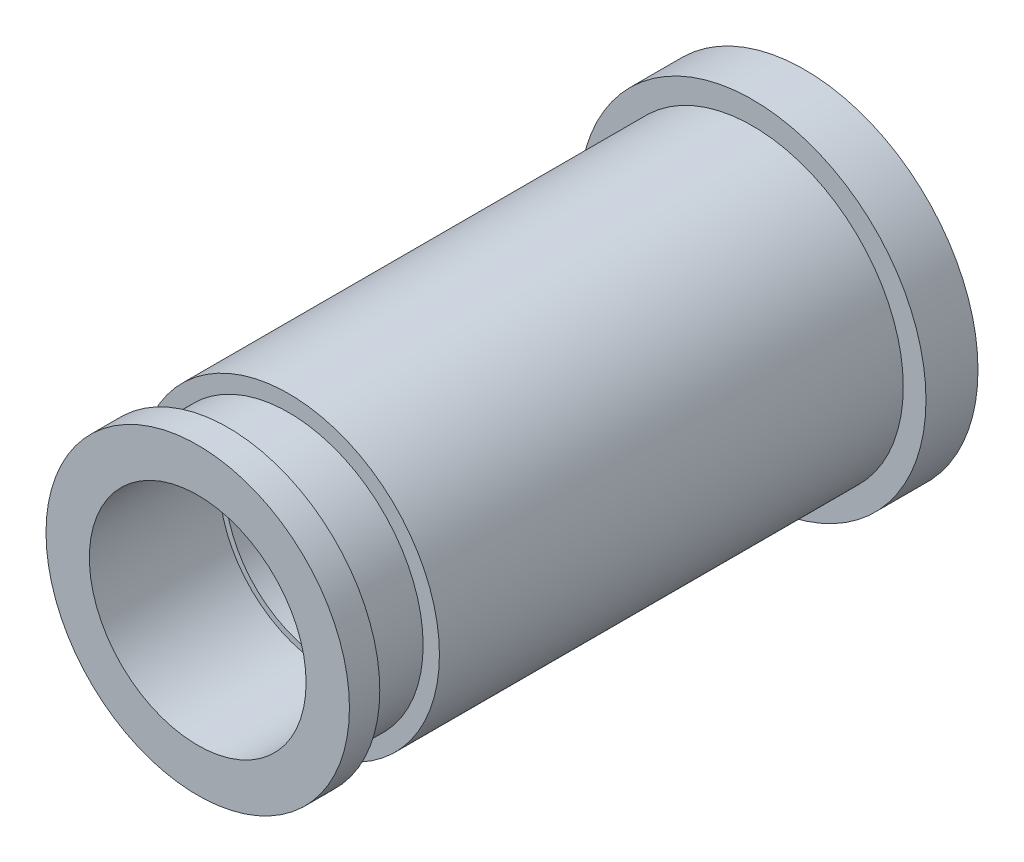
ISO-10303-21;
HEADER;
FILE_DESCRIPTION(('STEP AP214'),'2;1');
FILE_NAME('part.step','',(''),(''),'','','');
FILE_SCHEMA(('AUTOMOTIVE_DESIGN { 1 0 10303 214 1 1 1 1 }'));
ENDSEC;
DATA;
#1=APPLICATION_CONTEXT('core data for automotive mechanical design processes');
#2=APPLICATION_PROTOCOL_DEFINITION('international standard','automotive_design',2000,#1);
#3=PRODUCT_CONTEXT('',#1,'mechanical');
#4=PRODUCT('Part','Part','',(#3));
#5=PRODUCT_RELATED_PRODUCT_CATEGORY('part','',(#4));
#6=PRODUCT_DEFINITION_FORMATION('','',#4);
#7=PRODUCT_DEFINITION_CONTEXT('part definition',#1,'design');
#8=PRODUCT_DEFINITION('design','',#6,#7);
#9=PRODUCT_DEFINITION_SHAPE('','',#8);
#10=(LENGTH_UNIT() NAMED_UNIT(*) SI_UNIT(.MILLI.,.METRE.));
#11=(NAMED_UNIT(*) PLANE_ANGLE_UNIT() SI_UNIT($,.RADIAN.));
#12=(NAMED_UNIT(*) SI_UNIT($,.STERADIAN.) SOLID_ANGLE_UNIT());
#13=UNCERTAINTY_MEASURE_WITH_UNIT(LENGTH_MEASURE(1.E-05),#10,'distance_accuracy_value','');
#14=(GEOMETRIC_REPRESENTATION_CONTEXT(3) GLOBAL_UNCERTAINTY_ASSIGNED_CONTEXT((#13)) GLOBAL_UNIT_ASSIGNED_CONTEXT((#10,
#11,#12)) REPRESENTATION_CONTEXT('',''));
#15=CARTESIAN_POINT('',(0.,0.,0.));
#16=DIRECTION('',(0.,0.,1.));
#17=DIRECTION('',(1.,0.,0.));
#18=AXIS2_PLACEMENT_3D('',#15,#16,#17);
#19=CARTESIAN_POINT('',(0.,19.84375,61.2065264612954));
#20=DIRECTION('',(0.,0.,-1.));
#21=DIRECTION('',(-1.,0.,0.));
#22=AXIS2_PLACEMENT_3D('',#19,#20,#21);
#23=PLANE('',#22);
#24=CARTESIAN_POINT('',(0.,0.,61.2065264612954));
#25=DIRECTION('',(0.,0.,1.));
#26=DIRECTION('',(1.,0.,0.));
#27=AXIS2_PLACEMENT_3D('',#24,#25,#26);
#28=CIRCLE('',#27,19.84375);
#29=CARTESIAN_POINT('',(19.84375,0.,61.2065264612954));
#30=VERTEX_POINT('',#29);
#31=EDGE_CURVE('E90',#30,#30,#28,.T.);
#32=ORIENTED_EDGE('',*,*,#31,.F.);
#33=EDGE_LOOP('',(#32));
#34=FACE_BOUND('',#33,.T.);
#35=CARTESIAN_POINT('',(0.,0.,61.2065264612954));
#36=DIRECTION('',(0.,0.,1.));
#37=DIRECTION('',(1.,0.,0.));
#38=AXIS2_PLACEMENT_3D('',#35,#36,#37);
#39=CIRCLE('',#38,27.78125);
#40=CARTESIAN_POINT('',(27.78125,0.,61.2065264612954));
#41=VERTEX_POINT('',#40);
#42=EDGE_CURVE('E57',#41,#41,#39,.T.);
#43=ORIENTED_EDGE('',*,*,#42,.T.);
#44=EDGE_LOOP('',(#43));
#45=FACE_BOUND('',#44,.T.);
#46=ADVANCED_FACE('F46',(#34,#45),#23,.F.);
#47=CARTESIAN_POINT('',(0.,0.,20.5396919431279));
#48=DIRECTION('',(0.,0.,1.));
#49=DIRECTION('',(1.,0.,0.));
#50=AXIS2_PLACEMENT_3D('',#47,#48,#49);
#51=CYLINDRICAL_SURFACE('',#50,27.78125);
#52=ORIENTED_EDGE('',*,*,#42,.F.);
#53=EDGE_LOOP('',(#52));
#54=FACE_BOUND('',#53,.T.);
#55=CARTESIAN_POINT('',(0.,0.,55.6502764612954));
#56=DIRECTION('',(0.,0.,1.));
#57=DIRECTION('',(1.,0.,0.));
#58=AXIS2_PLACEMENT_3D('',#55,#56,#57);
#59=CIRCLE('',#58,27.78125);
#60=CARTESIAN_POINT('',(27.78125,0.,55.6502764612954));
#61=VERTEX_POINT('',#60);
#62=EDGE_CURVE('E61',#61,#61,#59,.T.);
#63=ORIENTED_EDGE('',*,*,#62,.T.);
#64=EDGE_LOOP('',(#63));
#65=FACE_BOUND('',#64,.T.);
#66=ADVANCED_FACE('F98',(#54,#65),#51,.T.);
#67=CARTESIAN_POINT('',(0.,27.78125,55.6502764612954));
#68=DIRECTION('',(0.,0.,1.));
#69=DIRECTION('',(1.,0.,0.));
#70=AXIS2_PLACEMENT_3D('',#67,#68,#69);
#71=PLANE('',#70);
#72=ORIENTED_EDGE('',*,*,#62,.F.);
#73=EDGE_LOOP('',(#72));
#74=FACE_BOUND('',#73,.T.);
#75=CARTESIAN_POINT('',(0.,0.,55.6502764612954));
#76=DIRECTION('',(0.,0.,1.));
#77=DIRECTION('',(1.,0.,0.));
#78=AXIS2_PLACEMENT_3D('',#75,#76,#77);
#79=CIRCLE('',#78,24.60625);
#80=CARTESIAN_POINT('',(24.60625,0.,55.6502764612954));
#81=VERTEX_POINT('',#80);
#82=EDGE_CURVE('E66',#81,#81,#79,.T.);
#83=ORIENTED_EDGE('',*,*,#82,.T.);
#84=EDGE_LOOP('',(#83));
#85=FACE_BOUND('',#84,.T.);
#86=ADVANCED_FACE('F103',(#74,#85),#71,.F.);
#87=CARTESIAN_POINT('',(0.,0.,20.5396919431279));
#88=DIRECTION('',(0.,0.,1.));
#89=DIRECTION('',(1.,0.,0.));
#90=AXIS2_PLACEMENT_3D('',#87,#88,#89);
#91=CYLINDRICAL_SURFACE('',#90,24.60625);
#92=ORIENTED_EDGE('',*,*,#82,.F.);
#93=EDGE_LOOP('',(#92));
#94=FACE_BOUND('',#93,.T.);
#95=CARTESIAN_POINT('',(0.,0.,44.5377764612954));
#96=DIRECTION('',(0.,0.,1.));
#97=DIRECTION('',(1.,0.,0.));
#98=AXIS2_PLACEMENT_3D('',#95,#96,#97);
#99=CIRCLE('',#98,24.60625);
#100=CARTESIAN_POINT('',(24.60625,0.,44.5377764612954));
#101=VERTEX_POINT('',#100);
#102=EDGE_CURVE('E69',#101,#101,#99,.T.);
#103=ORIENTED_EDGE('',*,*,#102,.T.);
#104=EDGE_LOOP('',(#103));
#105=FACE_BOUND('',#104,.T.);
#106=ADVANCED_FACE('F109',(#94,#105),#91,.T.);
#107=CARTESIAN_POINT('',(0.,24.60625,44.5377764612954));
#108=DIRECTION('',(0.,0.,-1.));
#109=DIRECTION('',(-1.,0.,0.));
#110=AXIS2_PLACEMENT_3D('',#107,#108,#109);
#111=PLANE('',#110);
#112=ORIENTED_EDGE('',*,*,#102,.F.);
#113=EDGE_LOOP('',(#112));
#114=FACE_BOUND('',#113,.T.);
#115=CARTESIAN_POINT('',(0.,0.,44.5377764612954));
#116=DIRECTION('',(0.,0.,1.));
#117=DIRECTION('',(1.,0.,0.));
#118=AXIS2_PLACEMENT_3D('',#115,#116,#117);
#119=CIRCLE('',#118,27.5906496840442);
#120=CARTESIAN_POINT('',(27.5906496840442,0.,44.5377764612954));
#121=VERTEX_POINT('',#120);
#122=EDGE_CURVE('E72',#121,#121,#119,.T.);
#123=ORIENTED_EDGE('',*,*,#122,.T.);
#124=EDGE_LOOP('',(#123));
#125=FACE_BOUND('',#124,.T.);
#126=ADVANCED_FACE('F115',(#114,#125),#111,.F.);
#127=CARTESIAN_POINT('',(0.,0.,20.5396919431279));
#128=DIRECTION('',(0.,0.,1.));
#129=DIRECTION('',(1.,0.,0.));
#130=AXIS2_PLACEMENT_3D('',#127,#128,#129);
#131=CYLINDRICAL_SURFACE('',#130,27.5906496840442);
#132=ORIENTED_EDGE('',*,*,#122,.F.);
#133=EDGE_LOOP('',(#132));
#134=FACE_BOUND('',#133,.T.);
#135=CARTESIAN_POINT('',(0.,0.,-40.3934735387046));
#136=DIRECTION('',(0.,0.,1.));
#137=DIRECTION('',(1.,0.,0.));
#138=AXIS2_PLACEMENT_3D('',#135,#136,#137);
#139=CIRCLE('',#138,27.5906496840442);
#140=CARTESIAN_POINT('',(27.5906496840442,0.,-40.3934735387046));
#141=VERTEX_POINT('',#140);
#142=EDGE_CURVE('E75',#141,#141,#139,.T.);
#143=ORIENTED_EDGE('',*,*,#142,.T.);
#144=EDGE_LOOP('',(#143));
#145=FACE_BOUND('',#144,.T.);
#146=ADVANCED_FACE('F121',(#134,#145),#131,.T.);
#147=CARTESIAN_POINT('',(0.,27.5906496840442,-40.3934735387046));
#148=DIRECTION('',(0.,0.,-1.));
#149=DIRECTION('',(-1.,0.,0.));
#150=AXIS2_PLACEMENT_3D('',#147,#148,#149);
#151=PLANE('',#150);
#152=ORIENTED_EDGE('',*,*,#142,.F.);
#153=EDGE_LOOP('',(#152));
#154=FACE_BOUND('',#153,.T.);
#155=CARTESIAN_POINT('',(0.,0.,-40.3934735387046));
#156=DIRECTION('',(0.,0.,1.));
#157=DIRECTION('',(1.,0.,0.));
#158=AXIS2_PLACEMENT_3D('',#155,#156,#157);
#159=CIRCLE('',#158,31.75);
#160=CARTESIAN_POINT('',(31.75,0.,-40.3934735387046));
#161=VERTEX_POINT('',#160);
#162=EDGE_CURVE('E78',#161,#161,#159,.T.);
#163=ORIENTED_EDGE('',*,*,#162,.T.);
#164=EDGE_LOOP('',(#163));
#165=FACE_BOUND('',#164,.T.);
#166=ADVANCED_FACE('F127',(#154,#165),#151,.F.);
#167=CARTESIAN_POINT('',(0.,0.,20.5396919431279));
#168=DIRECTION('',(0.,0.,1.));
#169=DIRECTION('',(1.,0.,0.));
#170=AXIS2_PLACEMENT_3D('',#167,#168,#169);
#171=CYLINDRICAL_SURFACE('',#170,31.75);
#172=ORIENTED_EDGE('',*,*,#162,.F.);
#173=EDGE_LOOP('',(#172));
#174=FACE_BOUND('',#173,.T.);
#175=CARTESIAN_POINT('',(0.,0.,-49.9184735387046));
#176=DIRECTION('',(0.,0.,1.));
#177=DIRECTION('',(1.,0.,0.));
#178=AXIS2_PLACEMENT_3D('',#175,#176,#177);
#179=CIRCLE('',#178,31.75);
#180=CARTESIAN_POINT('',(31.75,0.,-49.9184735387046));
#181=VERTEX_POINT('',#180);
#182=EDGE_CURVE('E81',#181,#181,#179,.T.);
#183=ORIENTED_EDGE('',*,*,#182,.T.);
#184=EDGE_LOOP('',(#183));
#185=FACE_BOUND('',#184,.T.);
#186=ADVANCED_FACE('F133',(#174,#185),#171,.T.);
#187=CARTESIAN_POINT('',(0.,31.75,-49.9184735387046));
#188=DIRECTION('',(0.,0.,1.));
#189=DIRECTION('',(1.,0.,0.));
#190=AXIS2_PLACEMENT_3D('',#187,#188,#189);
#191=PLANE('',#190);
#192=CARTESIAN_POINT('',(0.,0.,-49.9184735387046));
#193=DIRECTION('',(0.,0.,1.));
#194=DIRECTION('',(1.,0.,0.));
#195=AXIS2_PLACEMENT_3D('',#192,#193,#194);
#196=CIRCLE('',#195,19.5883977392313);
#197=CARTESIAN_POINT('',(19.5883977392313,0.,-49.9184735387046));
#198=VERTEX_POINT('',#197);
#199=EDGE_CURVE('E53',#198,#198,#196,.T.);
#200=ORIENTED_EDGE('',*,*,#199,.T.);
#201=EDGE_LOOP('',(#200));
#202=FACE_BOUND('',#201,.T.);
#203=ORIENTED_EDGE('',*,*,#182,.F.);
#204=EDGE_LOOP('',(#203));
#205=FACE_BOUND('',#204,.T.);
#206=ADVANCED_FACE('F139',(#202,#205),#191,.F.);
#207=CARTESIAN_POINT('',(0.,0.,20.5396919431279));
#208=DIRECTION('',(0.,0.,1.));
#209=DIRECTION('',(1.,0.,0.));
#210=AXIS2_PLACEMENT_3D('',#207,#208,#209);
#211=CYLINDRICAL_SURFACE('',#210,18.7946477392313);
#212=CARTESIAN_POINT('',(0.,0.,-49.1247235387046));
#213=DIRECTION('',(0.,0.,1.));
#214=DIRECTION('',(1.,0.,0.));
#215=AXIS2_PLACEMENT_3D('',#212,#213,#214);
#216=CIRCLE('',#215,18.7946477392313);
#217=CARTESIAN_POINT('',(18.7946477392313,0.,-49.1247235387046));
#218=VERTEX_POINT('',#217);
#219=EDGE_CURVE('E12',#218,#218,#216,.F.);
#220=ORIENTED_EDGE('',*,*,#219,.T.);
#221=EDGE_LOOP('',(#220));
#222=FACE_BOUND('',#221,.T.);
#223=CARTESIAN_POINT('',(0.,0.,37.3940264612954));
#224=DIRECTION('',(0.,0.,1.));
#225=DIRECTION('',(1.,0.,0.));
#226=AXIS2_PLACEMENT_3D('',#223,#224,#225);
#227=CIRCLE('',#226,18.7946477392313);
#228=CARTESIAN_POINT('',(18.7946477392313,0.,37.3940264612954));
#229=VERTEX_POINT('',#228);
#230=EDGE_CURVE('E84',#229,#229,#227,.T.);
#231=ORIENTED_EDGE('',*,*,#230,.T.);
#232=EDGE_LOOP('',(#231));
#233=FACE_BOUND('',#232,.T.);
#234=ADVANCED_FACE('F144',(#222,#233),#211,.F.);
#235=CARTESIAN_POINT('',(0.,19.84375,37.3940264612954));
#236=DIRECTION('',(0.,0.,-1.));
#237=DIRECTION('',(-1.,0.,0.));
#238=AXIS2_PLACEMENT_3D('',#235,#236,#237);
#239=PLANE('',#238);
#240=ORIENTED_EDGE('',*,*,#230,.F.);
#241=EDGE_LOOP('',(#240));
#242=FACE_BOUND('',#241,.T.);
#243=CARTESIAN_POINT('',(0.,0.,37.3940264612954));
#244=DIRECTION('',(0.,0.,1.));
#245=DIRECTION('',(1.,0.,0.));
#246=AXIS2_PLACEMENT_3D('',#243,#244,#245);
#247=CIRCLE('',#246,19.84375);
#248=CARTESIAN_POINT('',(19.84375,0.,37.3940264612954));
#249=VERTEX_POINT('',#248);
#250=EDGE_CURVE('E87',#249,#249,#247,.T.);
#251=ORIENTED_EDGE('',*,*,#250,.T.);
#252=EDGE_LOOP('',(#251));
#253=FACE_BOUND('',#252,.T.);
#254=ADVANCED_FACE('F149',(#242,#253),#239,.F.);
#255=CARTESIAN_POINT('',(0.,0.,20.5396919431279));
#256=DIRECTION('',(0.,0.,1.));
#257=DIRECTION('',(1.,0.,0.));
#258=AXIS2_PLACEMENT_3D('',#255,#256,#257);
#259=CYLINDRICAL_SURFACE('',#258,19.84375);
#260=ORIENTED_EDGE('',*,*,#250,.F.);
#261=EDGE_LOOP('',(#260));
#262=FACE_BOUND('',#261,.T.);
#263=ORIENTED_EDGE('',*,*,#31,.T.);
#264=EDGE_LOOP('',(#263));
#265=FACE_BOUND('',#264,.T.);
#266=ADVANCED_FACE('F94',(#262,#265),#259,.F.);
#267=CARTESIAN_POINT('',(0.,0.,-49.1247235387046));
#268=DIRECTION('',(0.,0.,1.));
#269=DIRECTION('',(1.,0.,0.));
#270=AXIS2_PLACEMENT_3D('',#267,#268,#269);
#271=TOROIDAL_SURFACE('',#270,19.5883977392313,0.79375);
#272=ORIENTED_EDGE('',*,*,#219,.F.);
#273=EDGE_LOOP('',(#272));
#274=FACE_BOUND('',#273,.T.);
#275=ORIENTED_EDGE('',*,*,#199,.F.);
#276=EDGE_LOOP('',(#275));
#277=FACE_BOUND('',#276,.T.);
#278=ADVANCED_FACE('F48',(#274,#277),#271,.T.);
#279=CLOSED_SHELL('',(#46,#66,#86,#106,#126,#146,#166,#186,#206,#234,#254,#266,#278));
#280=MANIFOLD_SOLID_BREP('B2',#279);
#281=ADVANCED_BREP_SHAPE_REPRESENTATION('',(#18,#280),#14);
#282=SHAPE_DEFINITION_REPRESENTATION(#9,#281);
ENDSEC;
END-ISO-10303-21;
